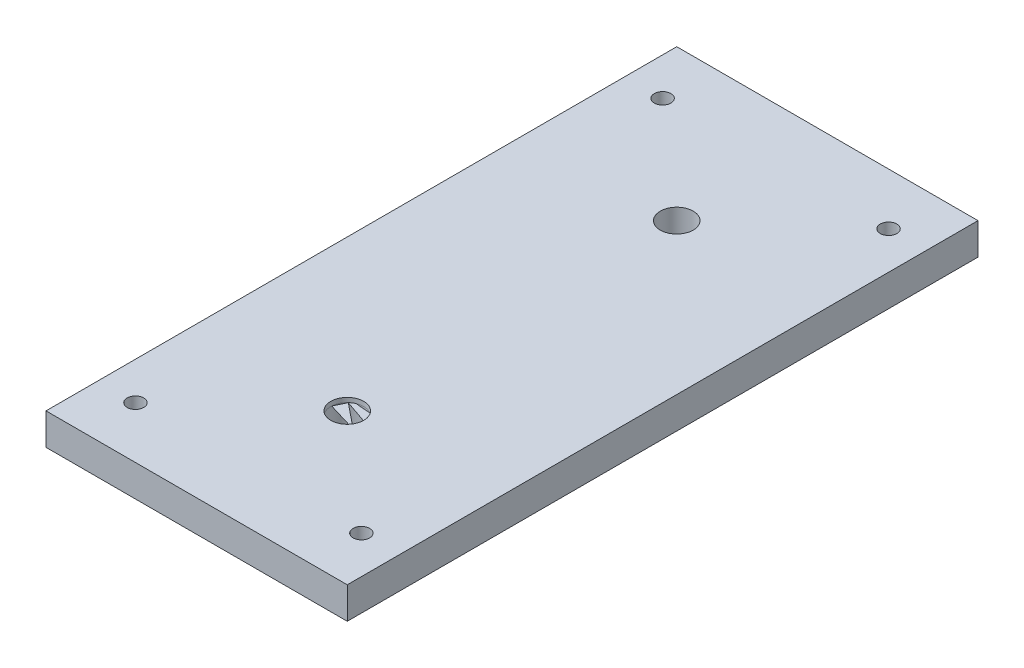
ISO-10303-21;
HEADER;
FILE_DESCRIPTION(('STEP AP214'),'2;1');
FILE_NAME('part.step','',(''),(''),'','','');
FILE_SCHEMA(('AUTOMOTIVE_DESIGN { 1 0 10303 214 1 1 1 1 }'));
ENDSEC;
DATA;
#1=APPLICATION_CONTEXT('core data for automotive mechanical design processes');
#2=APPLICATION_PROTOCOL_DEFINITION('international standard','automotive_design',2000,#1);
#3=PRODUCT_CONTEXT('',#1,'mechanical');
#4=PRODUCT('Part','Part','',(#3));
#5=PRODUCT_RELATED_PRODUCT_CATEGORY('part','',(#4));
#6=PRODUCT_DEFINITION_FORMATION('','',#4);
#7=PRODUCT_DEFINITION_CONTEXT('part definition',#1,'design');
#8=PRODUCT_DEFINITION('design','',#6,#7);
#9=PRODUCT_DEFINITION_SHAPE('','',#8);
#10=(LENGTH_UNIT() NAMED_UNIT(*) SI_UNIT(.MILLI.,.METRE.));
#11=(NAMED_UNIT(*) PLANE_ANGLE_UNIT() SI_UNIT($,.RADIAN.));
#12=(NAMED_UNIT(*) SI_UNIT($,.STERADIAN.) SOLID_ANGLE_UNIT());
#13=UNCERTAINTY_MEASURE_WITH_UNIT(LENGTH_MEASURE(1.E-05),#10,'distance_accuracy_value','');
#14=(GEOMETRIC_REPRESENTATION_CONTEXT(3) GLOBAL_UNCERTAINTY_ASSIGNED_CONTEXT((#13)) GLOBAL_UNIT_ASSIGNED_CONTEXT((#10,
#11,#12)) REPRESENTATION_CONTEXT('',''));
#15=CARTESIAN_POINT('',(0.,0.,0.));
#16=DIRECTION('',(0.,0.,1.));
#17=DIRECTION('',(1.,0.,0.));
#18=AXIS2_PLACEMENT_3D('',#15,#16,#17);
#19=CARTESIAN_POINT('',(-3.1511529728443,-11.365306556526,-3.57587472478323));
#20=DIRECTION('',(0.,-1.,0.));
#21=DIRECTION('',(0.,0.,1.));
#22=AXIS2_PLACEMENT_3D('',#19,#20,#21);
#23=SPHERICAL_SURFACE('',#22,12.7);
#24=CARTESIAN_POINT('',(-3.1511529728443,0.763193443473996,-3.57587472478323));
#25=DIRECTION('',(0.,-1.,0.));
#26=DIRECTION('',(0.,0.,-1.));
#27=AXIS2_PLACEMENT_3D('',#24,#25,#26);
#28=CIRCLE('',#27,3.76689364729083);
#29=CARTESIAN_POINT('',(-3.1511529728443,0.763193443473996,-7.34276837207405));
#30=VERTEX_POINT('',#29);
#31=EDGE_CURVE('E11',#30,#30,#28,.T.);
#32=ORIENTED_EDGE('',*,*,#31,.F.);
#33=EDGE_LOOP('',(#32));
#34=FACE_BOUND('',#33,.T.);
#35=ADVANCED_FACE('F43',(#34),#23,.T.);
#36=CARTESIAN_POINT('',(-12.2889229741077,0.763193443473996,-28.2015692205846));
#37=DIRECTION('',(0.,-1.,0.));
#38=DIRECTION('',(0.,0.,-1.));
#39=AXIS2_PLACEMENT_3D('',#36,#37,#38);
#40=PLANE('',#39);
#41=ORIENTED_EDGE('',*,*,#31,.T.);
#42=EDGE_LOOP('',(#41));
#43=FACE_BOUND('',#42,.T.);
#44=ADVANCED_FACE('F50',(#43),#40,.T.);
#45=CLOSED_SHELL('',(#35,#44));
#46=MANIFOLD_SOLID_BREP('B2',#45);
#47=CARTESIAN_POINT('',(0.,0.763193443473996,0.));
#48=DIRECTION('',(0.,1.,0.));
#49=DIRECTION('',(0.,0.,1.));
#50=AXIS2_PLACEMENT_3D('',#47,#48,#49);
#51=PLANE('',#50);
#52=CARTESIAN_POINT('',(15.8988470271548,0.763193443473996,40.8741252752168));
#53=DIRECTION('',(0.,-1.,0.));
#54=DIRECTION('',(0.,0.,-1.));
#55=AXIS2_PLACEMENT_3D('',#52,#53,#54);
#56=CIRCLE('',#55,1.397);
#57=CARTESIAN_POINT('',(15.8988470271548,0.763193443473996,39.4771252752168));
#58=VERTEX_POINT('',#57);
#59=EDGE_CURVE('E240',#58,#58,#56,.T.);
#60=ORIENTED_EDGE('',*,*,#59,.F.);
#61=EDGE_LOOP('',(#60));
#62=FACE_BOUND('',#61,.T.);
#63=CARTESIAN_POINT('',(-22.2011529728452,0.763193443473996,40.8741252752165));
#64=DIRECTION('',(0.,-1.,0.));
#65=DIRECTION('',(0.,0.,-1.));
#66=AXIS2_PLACEMENT_3D('',#63,#64,#65);
#67=CIRCLE('',#66,1.397);
#68=CARTESIAN_POINT('',(-22.2011529728452,0.763193443473996,39.4771252752165));
#69=VERTEX_POINT('',#68);
#70=EDGE_CURVE('E236',#69,#69,#67,.T.);
#71=ORIENTED_EDGE('',*,*,#70,.F.);
#72=EDGE_LOOP('',(#71));
#73=FACE_BOUND('',#72,.T.);
#74=CARTESIAN_POINT('',(15.8988470271557,0.763193443473996,-48.0258747247832));
#75=DIRECTION('',(0.,-1.,0.));
#76=DIRECTION('',(0.,0.,-1.));
#77=AXIS2_PLACEMENT_3D('',#74,#75,#76);
#78=CIRCLE('',#77,1.397);
#79=CARTESIAN_POINT('',(15.8988470271557,0.763193443473996,-49.4228747247832));
#80=VERTEX_POINT('',#79);
#81=EDGE_CURVE('E232',#80,#80,#78,.T.);
#82=ORIENTED_EDGE('',*,*,#81,.F.);
#83=EDGE_LOOP('',(#82));
#84=FACE_BOUND('',#83,.T.);
#85=CARTESIAN_POINT('',(-22.2011529728443,0.763193443473996,-48.0258747247835));
#86=DIRECTION('',(0.,-1.,0.));
#87=DIRECTION('',(0.,0.,-1.));
#88=AXIS2_PLACEMENT_3D('',#85,#86,#87);
#89=CIRCLE('',#88,1.397);
#90=CARTESIAN_POINT('',(-22.2011529728443,0.763193443473996,-49.4228747247835));
#91=VERTEX_POINT('',#90);
#92=EDGE_CURVE('E227',#91,#91,#89,.T.);
#93=ORIENTED_EDGE('',*,*,#92,.F.);
#94=EDGE_LOOP('',(#93));
#95=FACE_BOUND('',#94,.T.);
#96=DIRECTION('',(1.,0.,0.));
#97=VECTOR('',#96,1.);
#98=CARTESIAN_POINT('',(-28.5511529728443,0.763193443473996,49.6053752752168));
#99=LINE('',#98,#97);
#100=CARTESIAN_POINT('',(-28.5511529728443,0.763193443473996,49.6053752752168));
#101=VERTEX_POINT('',#100);
#102=CARTESIAN_POINT('',(22.2488470271557,0.763193443473996,49.6053752752168));
#103=VERTEX_POINT('',#102);
#104=EDGE_CURVE('E123',#101,#103,#99,.T.);
#105=ORIENTED_EDGE('',*,*,#104,.F.);
#106=DIRECTION('',(0.,0.,1.));
#107=VECTOR('',#106,1.);
#108=CARTESIAN_POINT('',(-28.5511529728443,0.763193443473996,-56.7571247247832));
#109=LINE('',#108,#107);
#110=CARTESIAN_POINT('',(-28.5511529728443,0.763193443473996,-56.7571247247832));
#111=VERTEX_POINT('',#110);
#112=EDGE_CURVE('E112',#111,#101,#109,.T.);
#113=ORIENTED_EDGE('',*,*,#112,.F.);
#114=DIRECTION('',(-1.,0.,0.));
#115=VECTOR('',#114,1.);
#116=CARTESIAN_POINT('',(-28.5511529728443,0.763193443473996,-56.7571247247832));
#117=LINE('',#116,#115);
#118=CARTESIAN_POINT('',(22.2488470271557,0.763193443473996,-56.7571247247832));
#119=VERTEX_POINT('',#118);
#120=EDGE_CURVE('E132',#119,#111,#117,.T.);
#121=ORIENTED_EDGE('',*,*,#120,.F.);
#122=DIRECTION('',(0.,0.,-1.));
#123=VECTOR('',#122,1.);
#124=CARTESIAN_POINT('',(22.2488470271557,0.763193443473996,-56.7571247247832));
#125=LINE('',#124,#123);
#126=EDGE_CURVE('E136',#103,#119,#125,.T.);
#127=ORIENTED_EDGE('',*,*,#126,.F.);
#128=EDGE_LOOP('',(#105,#113,#121,#127));
#129=FACE_BOUND('',#128,.T.);
#130=CARTESIAN_POINT('',(-3.15115297284421,0.763193443473996,-31.3571247247832));
#131=DIRECTION('',(0.,1.,0.));
#132=DIRECTION('',(0.,0.,1.));
#133=AXIS2_PLACEMENT_3D('',#130,#131,#132);
#134=CIRCLE('',#133,2.7781250000001);
#135=CARTESIAN_POINT('',(-3.15115297284431,0.763193443473996,-34.1352497247832));
#136=VERTEX_POINT('',#135);
#137=EDGE_CURVE('E224',#136,#136,#134,.T.);
#138=ORIENTED_EDGE('',*,*,#137,.T.);
#139=EDGE_LOOP('',(#138));
#140=FACE_BOUND('',#139,.T.);
#141=CARTESIAN_POINT('',(-3.17534581292681,0.763193443473996,24.2114587291356));
#142=DIRECTION('',(0.,1.,0.));
#143=DIRECTION('',(0.,0.,1.));
#144=AXIS2_PLACEMENT_3D('',#141,#142,#143);
#145=CIRCLE('',#144,2.80307098009381);
#146=CARTESIAN_POINT('',(-3.17534581292681,0.763193443473996,27.0145297092294));
#147=VERTEX_POINT('',#146);
#148=EDGE_CURVE('E144',#147,#147,#145,.T.);
#149=ORIENTED_EDGE('',*,*,#148,.T.);
#150=EDGE_LOOP('',(#149));
#151=FACE_BOUND('',#150,.T.);
#152=ADVANCED_FACE('F69',(#62,#73,#84,#95,#129,#140,#151),#51,.F.);
#153=CARTESIAN_POINT('',(-3.17534581292681,0.763193443473996,24.2114587291356));
#154=DIRECTION('',(0.,1.,0.));
#155=DIRECTION('',(0.,0.,1.));
#156=AXIS2_PLACEMENT_3D('',#153,#154,#155);
#157=CYLINDRICAL_SURFACE('',#156,2.80307098009381);
#158=ORIENTED_EDGE('',*,*,#148,.F.);
#159=EDGE_LOOP('',(#158));
#160=FACE_BOUND('',#159,.T.);
#161=CARTESIAN_POINT('',(-3.17534581292681,5.335193443474,24.2114587291356));
#162=DIRECTION('',(0.,1.,0.));
#163=DIRECTION('',(0.,0.,1.));
#164=AXIS2_PLACEMENT_3D('',#161,#162,#163);
#165=CIRCLE('',#164,2.80307098009381);
#166=CARTESIAN_POINT('',(-0.456901891047282,5.335193443474,23.5278875455415));
#167=VERTEX_POINT('',#166);
#168=EDGE_CURVE('E151',#167,#167,#165,.T.);
#169=ORIENTED_EDGE('',*,*,#168,.T.);
#170=EDGE_LOOP('',(#169));
#171=FACE_BOUND('',#170,.T.);
#172=ADVANCED_FACE('F162',(#160,#171),#157,.F.);
#173=CARTESIAN_POINT('',(-28.5511529728443,0.763193443473996,-56.7571247247832));
#174=DIRECTION('',(-1.,0.,0.));
#175=DIRECTION('',(0.,0.,1.));
#176=AXIS2_PLACEMENT_3D('',#173,#174,#175);
#177=PLANE('',#176);
#178=DIRECTION('',(0.,0.,1.));
#179=VECTOR('',#178,1.);
#180=CARTESIAN_POINT('',(-28.5511529728443,6.097193443474,-56.7571247247832));
#181=LINE('',#180,#179);
#182=CARTESIAN_POINT('',(-28.5511529728443,6.097193443474,-56.7571247247832));
#183=VERTEX_POINT('',#182);
#184=CARTESIAN_POINT('',(-28.5511529728443,6.097193443474,49.6053752752168));
#185=VERTEX_POINT('',#184);
#186=EDGE_CURVE('E142',#183,#185,#181,.T.);
#187=ORIENTED_EDGE('',*,*,#186,.F.);
#188=DIRECTION('',(0.,1.,0.));
#189=VECTOR('',#188,1.);
#190=CARTESIAN_POINT('',(-28.5511529728443,0.763193443473996,-56.7571247247832));
#191=LINE('',#190,#189);
#192=EDGE_CURVE('E118',#111,#183,#191,.T.);
#193=ORIENTED_EDGE('',*,*,#192,.F.);
#194=ORIENTED_EDGE('',*,*,#112,.T.);
#195=DIRECTION('',(0.,1.,0.));
#196=VECTOR('',#195,1.);
#197=CARTESIAN_POINT('',(-28.5511529728443,0.763193443473996,49.6053752752168));
#198=LINE('',#197,#196);
#199=EDGE_CURVE('E115',#101,#185,#198,.T.);
#200=ORIENTED_EDGE('',*,*,#199,.T.);
#201=EDGE_LOOP('',(#187,#193,#194,#200));
#202=FACE_BOUND('',#201,.T.);
#203=ADVANCED_FACE('F114',(#202),#177,.T.);
#204=CARTESIAN_POINT('',(-28.5511529728443,0.763193443473996,-56.7571247247832));
#205=DIRECTION('',(0.,0.,-1.));
#206=DIRECTION('',(-1.,0.,0.));
#207=AXIS2_PLACEMENT_3D('',#204,#205,#206);
#208=PLANE('',#207);
#209=DIRECTION('',(-1.,0.,0.));
#210=VECTOR('',#209,1.);
#211=CARTESIAN_POINT('',(-28.5511529728443,6.097193443474,-56.7571247247832));
#212=LINE('',#211,#210);
#213=CARTESIAN_POINT('',(22.2488470271557,6.097193443474,-56.7571247247832));
#214=VERTEX_POINT('',#213);
#215=EDGE_CURVE('E124',#214,#183,#212,.T.);
#216=ORIENTED_EDGE('',*,*,#215,.F.);
#217=DIRECTION('',(0.,1.,0.));
#218=VECTOR('',#217,1.);
#219=CARTESIAN_POINT('',(22.2488470271557,0.763193443473996,-56.7571247247832));
#220=LINE('',#219,#218);
#221=EDGE_CURVE('E152',#119,#214,#220,.T.);
#222=ORIENTED_EDGE('',*,*,#221,.F.);
#223=ORIENTED_EDGE('',*,*,#120,.T.);
#224=ORIENTED_EDGE('',*,*,#192,.T.);
#225=EDGE_LOOP('',(#216,#222,#223,#224));
#226=FACE_BOUND('',#225,.T.);
#227=ADVANCED_FACE('F170',(#226),#208,.T.);
#228=CARTESIAN_POINT('',(22.2488470271557,0.763193443473996,-56.7571247247832));
#229=DIRECTION('',(1.,0.,0.));
#230=DIRECTION('',(0.,0.,-1.));
#231=AXIS2_PLACEMENT_3D('',#228,#229,#230);
#232=PLANE('',#231);
#233=DIRECTION('',(0.,0.,-1.));
#234=VECTOR('',#233,1.);
#235=CARTESIAN_POINT('',(22.2488470271557,6.097193443474,-56.7571247247832));
#236=LINE('',#235,#234);
#237=CARTESIAN_POINT('',(22.2488470271557,6.097193443474,49.6053752752168));
#238=VERTEX_POINT('',#237);
#239=EDGE_CURVE('E146',#238,#214,#236,.T.);
#240=ORIENTED_EDGE('',*,*,#239,.F.);
#241=DIRECTION('',(0.,1.,0.));
#242=VECTOR('',#241,1.);
#243=CARTESIAN_POINT('',(22.2488470271557,0.763193443473996,49.6053752752168));
#244=LINE('',#243,#242);
#245=EDGE_CURVE('E131',#103,#238,#244,.T.);
#246=ORIENTED_EDGE('',*,*,#245,.F.);
#247=ORIENTED_EDGE('',*,*,#126,.T.);
#248=ORIENTED_EDGE('',*,*,#221,.T.);
#249=EDGE_LOOP('',(#240,#246,#247,#248));
#250=FACE_BOUND('',#249,.T.);
#251=ADVANCED_FACE('F181',(#250),#232,.T.);
#252=CARTESIAN_POINT('',(-28.5511529728443,0.763193443473996,49.6053752752168));
#253=DIRECTION('',(0.,0.,1.));
#254=DIRECTION('',(1.,0.,0.));
#255=AXIS2_PLACEMENT_3D('',#252,#253,#254);
#256=PLANE('',#255);
#257=DIRECTION('',(1.,0.,0.));
#258=VECTOR('',#257,1.);
#259=CARTESIAN_POINT('',(-28.5511529728443,6.097193443474,49.6053752752168));
#260=LINE('',#259,#258);
#261=EDGE_CURVE('E130',#185,#238,#260,.T.);
#262=ORIENTED_EDGE('',*,*,#261,.F.);
#263=ORIENTED_EDGE('',*,*,#199,.F.);
#264=ORIENTED_EDGE('',*,*,#104,.T.);
#265=ORIENTED_EDGE('',*,*,#245,.T.);
#266=EDGE_LOOP('',(#262,#263,#264,#265));
#267=FACE_BOUND('',#266,.T.);
#268=ADVANCED_FACE('F128',(#267),#256,.T.);
#269=CARTESIAN_POINT('',(-3.1511529728443,6.097193443474,-3.57587472478323));
#270=DIRECTION('',(0.,1.,0.));
#271=DIRECTION('',(0.,0.,1.));
#272=AXIS2_PLACEMENT_3D('',#269,#270,#271);
#273=PLANE('',#272);
#274=CARTESIAN_POINT('',(15.8988470271548,6.097193443474,40.8741252752168));
#275=DIRECTION('',(0.,-1.,0.));
#276=DIRECTION('',(0.,0.,-1.));
#277=AXIS2_PLACEMENT_3D('',#274,#275,#276);
#278=CIRCLE('',#277,1.397);
#279=CARTESIAN_POINT('',(15.8988470271548,6.097193443474,39.4771252752168));
#280=VERTEX_POINT('',#279);
#281=EDGE_CURVE('E203',#280,#280,#278,.T.);
#282=ORIENTED_EDGE('',*,*,#281,.T.);
#283=EDGE_LOOP('',(#282));
#284=FACE_BOUND('',#283,.T.);
#285=CARTESIAN_POINT('',(-22.2011529728452,6.097193443474,40.8741252752165));
#286=DIRECTION('',(0.,-1.,0.));
#287=DIRECTION('',(0.,0.,-1.));
#288=AXIS2_PLACEMENT_3D('',#285,#286,#287);
#289=CIRCLE('',#288,1.397);
#290=CARTESIAN_POINT('',(-22.2011529728452,6.097193443474,39.4771252752165));
#291=VERTEX_POINT('',#290);
#292=EDGE_CURVE('E207',#291,#291,#289,.T.);
#293=ORIENTED_EDGE('',*,*,#292,.T.);
#294=EDGE_LOOP('',(#293));
#295=FACE_BOUND('',#294,.T.);
#296=CARTESIAN_POINT('',(15.8988470271557,6.097193443474,-48.0258747247832));
#297=DIRECTION('',(0.,-1.,0.));
#298=DIRECTION('',(0.,0.,-1.));
#299=AXIS2_PLACEMENT_3D('',#296,#297,#298);
#300=CIRCLE('',#299,1.397);
#301=CARTESIAN_POINT('',(15.8988470271557,6.097193443474,-49.4228747247832));
#302=VERTEX_POINT('',#301);
#303=EDGE_CURVE('E211',#302,#302,#300,.T.);
#304=ORIENTED_EDGE('',*,*,#303,.T.);
#305=EDGE_LOOP('',(#304));
#306=FACE_BOUND('',#305,.T.);
#307=CARTESIAN_POINT('',(-22.2011529728443,6.097193443474,-48.0258747247835));
#308=DIRECTION('',(0.,-1.,0.));
#309=DIRECTION('',(0.,0.,-1.));
#310=AXIS2_PLACEMENT_3D('',#307,#308,#309);
#311=CIRCLE('',#310,1.397);
#312=CARTESIAN_POINT('',(-22.2011529728443,6.097193443474,-49.4228747247835));
#313=VERTEX_POINT('',#312);
#314=EDGE_CURVE('E215',#313,#313,#311,.T.);
#315=ORIENTED_EDGE('',*,*,#314,.T.);
#316=EDGE_LOOP('',(#315));
#317=FACE_BOUND('',#316,.T.);
#318=ORIENTED_EDGE('',*,*,#239,.T.);
#319=ORIENTED_EDGE('',*,*,#215,.T.);
#320=ORIENTED_EDGE('',*,*,#186,.T.);
#321=ORIENTED_EDGE('',*,*,#261,.T.);
#322=EDGE_LOOP('',(#318,#319,#320,#321));
#323=FACE_BOUND('',#322,.T.);
#324=CARTESIAN_POINT('',(-3.1511529728443,6.097193443474,24.2053752752168));
#325=DIRECTION('',(0.,1.,0.));
#326=DIRECTION('',(0.,0.,1.));
#327=AXIS2_PLACEMENT_3D('',#324,#325,#326);
#328=CIRCLE('',#327,2.778125);
#329=CARTESIAN_POINT('',(-3.1511529728443,6.097193443474,26.9835002752168));
#330=VERTEX_POINT('',#329);
#331=EDGE_CURVE('E77',#330,#330,#328,.T.);
#332=ORIENTED_EDGE('',*,*,#331,.F.);
#333=EDGE_LOOP('',(#332));
#334=FACE_BOUND('',#333,.T.);
#335=CARTESIAN_POINT('',(-3.15115297284431,6.097193443474,-31.3571247247832));
#336=DIRECTION('',(0.,1.,0.));
#337=DIRECTION('',(0.,0.,1.));
#338=AXIS2_PLACEMENT_3D('',#335,#336,#337);
#339=CIRCLE('',#338,2.778125);
#340=CARTESIAN_POINT('',(-3.15115297284431,6.097193443474,-34.1352497247832));
#341=VERTEX_POINT('',#340);
#342=EDGE_CURVE('E41',#341,#341,#339,.T.);
#343=ORIENTED_EDGE('',*,*,#342,.F.);
#344=EDGE_LOOP('',(#343));
#345=FACE_BOUND('',#344,.T.);
#346=CARTESIAN_POINT('',(-3.1511529728443,6.09719344347399,-3.57587472478323));
#347=VERTEX_POINT('',#346);
#348=VERTEX_LOOP('',#347);
#349=FACE_BOUND('',#348,.T.);
#350=ADVANCED_FACE('F187',(#284,#295,#306,#317,#323,#334,#345,#349),#273,.T.);
#351=CARTESIAN_POINT('',(-3.15115297284431,6.097193443474,-31.3571247247832));
#352=DIRECTION('',(0.,-1.,0.));
#353=DIRECTION('',(0.,0.,-1.));
#354=AXIS2_PLACEMENT_3D('',#351,#352,#353);
#355=CYLINDRICAL_SURFACE('',#354,2.778125);
#356=CARTESIAN_POINT('',(-3.15115297284431,6.097193443474,-34.1352497247832));
#357=CARTESIAN_POINT('',(-3.15115297284431,6.041630943474,-34.1352497247832));
#358=CARTESIAN_POINT('',(-3.15115297284431,5.98606844347399,-34.1352497247832));
#359=CARTESIAN_POINT('',(-3.15115297284431,5.874943443474,-34.1352497247832));
#360=CARTESIAN_POINT('',(-3.15115297284431,5.81938094347399,-34.1352497247832));
#361=CARTESIAN_POINT('',(-3.15115297284431,5.708255943474,-34.1352497247832));
#362=CARTESIAN_POINT('',(-3.15115297284431,5.65269344347399,-34.1352497247832));
#363=CARTESIAN_POINT('',(-3.15115297284431,5.541568443474,-34.1352497247832));
#364=CARTESIAN_POINT('',(-3.15115297284431,5.48600594347399,-34.1352497247832));
#365=CARTESIAN_POINT('',(-3.15115297284431,5.37488094347399,-34.1352497247832));
#366=CARTESIAN_POINT('',(-3.15115297284431,5.319318443474,-34.1352497247832));
#367=CARTESIAN_POINT('',(-3.15115297284431,5.20819344347399,-34.1352497247832));
#368=CARTESIAN_POINT('',(-3.15115297284431,5.152630943474,-34.1352497247832));
#369=CARTESIAN_POINT('',(-3.15115297284431,5.04150594347399,-34.1352497247832));
#370=CARTESIAN_POINT('',(-3.15115297284431,4.985943443474,-34.1352497247832));
#371=CARTESIAN_POINT('',(-3.15115297284431,4.87481844347399,-34.1352497247832));
#372=CARTESIAN_POINT('',(-3.15115297284431,4.81925594347399,-34.1352497247832));
#373=CARTESIAN_POINT('',(-3.15115297284431,4.70813094347399,-34.1352497247832));
#374=CARTESIAN_POINT('',(-3.15115297284431,4.65256844347399,-34.1352497247832));
#375=CARTESIAN_POINT('',(-3.15115297284431,4.54144344347399,-34.1352497247832));
#376=CARTESIAN_POINT('',(-3.15115297284431,4.485880943474,-34.1352497247832));
#377=CARTESIAN_POINT('',(-3.15115297284431,4.374755943474,-34.1352497247832));
#378=CARTESIAN_POINT('',(-3.15115297284431,4.319193443474,-34.1352497247832));
#379=CARTESIAN_POINT('',(-3.15115297284431,4.208068443474,-34.1352497247832));
#380=CARTESIAN_POINT('',(-3.15115297284431,4.15250594347399,-34.1352497247832));
#381=CARTESIAN_POINT('',(-3.15115297284431,4.041380943474,-34.1352497247832));
#382=CARTESIAN_POINT('',(-3.15115297284431,3.985818443474,-34.1352497247832));
#383=CARTESIAN_POINT('',(-3.15115297284431,3.874693443474,-34.1352497247832));
#384=CARTESIAN_POINT('',(-3.15115297284431,3.819130943474,-34.1352497247832));
#385=CARTESIAN_POINT('',(-3.15115297284431,3.70800594347399,-34.1352497247832));
#386=CARTESIAN_POINT('',(-3.15115297284431,3.652443443474,-34.1352497247832));
#387=CARTESIAN_POINT('',(-3.15115297284431,3.541318443474,-34.1352497247832));
#388=CARTESIAN_POINT('',(-3.15115297284431,3.485755943474,-34.1352497247832));
#389=CARTESIAN_POINT('',(-3.15115297284431,3.374630943474,-34.1352497247832));
#390=CARTESIAN_POINT('',(-3.15115297284431,3.31906844347399,-34.1352497247832));
#391=CARTESIAN_POINT('',(-3.15115297284431,3.207943443474,-34.1352497247832));
#392=CARTESIAN_POINT('',(-3.15115297284431,3.152380943474,-34.1352497247832));
#393=CARTESIAN_POINT('',(-3.15115297284431,3.041255943474,-34.1352497247832));
#394=CARTESIAN_POINT('',(-3.15115297284431,2.985693443474,-34.1352497247832));
#395=CARTESIAN_POINT('',(-3.15115297284431,2.87456844347399,-34.1352497247832));
#396=CARTESIAN_POINT('',(-3.15115297284431,2.819005943474,-34.1352497247832));
#397=CARTESIAN_POINT('',(-3.15115297284431,2.707880943474,-34.1352497247832));
#398=CARTESIAN_POINT('',(-3.15115297284431,2.652318443474,-34.1352497247832));
#399=CARTESIAN_POINT('',(-3.15115297284431,2.541193443474,-34.1352497247832));
#400=CARTESIAN_POINT('',(-3.15115297284431,2.48563094347399,-34.1352497247832));
#401=CARTESIAN_POINT('',(-3.15115297284431,2.374505943474,-34.1352497247832));
#402=CARTESIAN_POINT('',(-3.15115297284431,2.318943443474,-34.1352497247832));
#403=CARTESIAN_POINT('',(-3.15115297284431,2.207818443474,-34.1352497247832));
#404=CARTESIAN_POINT('',(-3.15115297284431,2.152255943474,-34.1352497247832));
#405=CARTESIAN_POINT('',(-3.15115297284431,2.041130943474,-34.1352497247832));
#406=CARTESIAN_POINT('',(-3.15115297284431,1.985568443474,-34.1352497247832));
#407=CARTESIAN_POINT('',(-3.15115297284431,1.874443443474,-34.1352497247832));
#408=CARTESIAN_POINT('',(-3.15115297284431,1.818880943474,-34.1352497247832));
#409=CARTESIAN_POINT('',(-3.15115297284431,1.707755943474,-34.1352497247832));
#410=CARTESIAN_POINT('',(-3.15115297284431,1.652193443474,-34.1352497247832));
#411=CARTESIAN_POINT('',(-3.15115297284431,1.541068443474,-34.1352497247832));
#412=CARTESIAN_POINT('',(-3.15115297284431,1.485505943474,-34.1352497247832));
#413=CARTESIAN_POINT('',(-3.15115297284431,1.374380943474,-34.1352497247832));
#414=CARTESIAN_POINT('',(-3.15115297284431,1.318818443474,-34.1352497247832));
#415=CARTESIAN_POINT('',(-3.15115297284431,1.207693443474,-34.1352497247832));
#416=CARTESIAN_POINT('',(-3.15115297284431,1.152130943474,-34.1352497247832));
#417=CARTESIAN_POINT('',(-3.15115297284431,1.041005943474,-34.1352497247832));
#418=CARTESIAN_POINT('',(-3.15115297284431,0.985443443473996,-34.1352497247832));
#419=CARTESIAN_POINT('',(-3.15115297284431,0.874318443473996,-34.1352497247832));
#420=CARTESIAN_POINT('',(-3.15115297284431,0.818755943473996,-34.1352497247832));
#421=CARTESIAN_POINT('',(-3.15115297284431,0.763193443473996,-34.1352497247832));
#422=B_SPLINE_CURVE_WITH_KNOTS('',3,(#356,#357,#358,#359,#360,#361,#362,#363,#364,#365,#366,
#367,#368,#369,#370,#371,#372,#373,#374,#375,#376,#377,#378,#379,#380,#381,#382,#383,#384,#385,
#386,#387,#388,#389,#390,#391,#392,#393,#394,#395,#396,#397,#398,#399,#400,#401,#402,#403,#404,
#405,#406,#407,#408,#409,#410,#411,#412,#413,#414,#415,#416,#417,#418,#419,#420,#421),
.UNSPECIFIED.,.F.,.F.,(4,2,2,2,2,2,2,2,2,2,2,2,2,2,2,2,2,2,2,2,2,2,2,2,2,2,2,2,2,2,2,2,4),(0.,
0.1666875,0.333375,0.500062500000001,0.666750000000001,0.8334375,1.000125,1.1668125,1.3335,
1.5001875,1.666875,1.8335625,2.00025,2.1669375,2.333625,2.5003125,2.667,2.8336875,3.000375,
3.1670625,3.33375,3.5004375,3.667125,3.8338125,4.0005,4.1671875,4.333875,4.5005625,4.66725,
4.8339375,5.000625,5.1673125,5.334),.UNSPECIFIED.);
#423=EDGE_CURVE('BSEAM192',#341,#136,#422,.T.);
#424=ORIENTED_EDGE('',*,*,#342,.T.);
#425=ORIENTED_EDGE('',*,*,#137,.F.);
#426=ORIENTED_EDGE('',*,*,#423,.T.);
#427=ORIENTED_EDGE('',*,*,#423,.F.);
#428=EDGE_LOOP('',(#424,#426,#425,#427));
#429=FACE_BOUND('',#428,.T.);
#430=ADVANCED_FACE('F192',(#429),#355,.F.);
#431=CARTESIAN_POINT('',(-3.1511529728443,6.097193443474,24.2053752752168));
#432=DIRECTION('',(0.,-1.,0.));
#433=DIRECTION('',(0.,0.,-1.));
#434=AXIS2_PLACEMENT_3D('',#431,#432,#433);
#435=CYLINDRICAL_SURFACE('',#434,2.778125);
#436=ORIENTED_EDGE('',*,*,#331,.T.);
#437=EDGE_LOOP('',(#436));
#438=FACE_BOUND('',#437,.T.);
#439=CARTESIAN_POINT('',(-3.1511529728443,5.335193443474,24.2053752752168));
#440=DIRECTION('',(0.,1.,0.));
#441=DIRECTION('',(0.,0.,1.));
#442=AXIS2_PLACEMENT_3D('',#439,#440,#441);
#443=CIRCLE('',#442,2.778125);
#444=EDGE_CURVE('E85',#167,#167,#443,.T.);
#445=ORIENTED_EDGE('',*,*,#444,.F.);
#446=EDGE_LOOP('',(#445));
#447=FACE_BOUND('',#446,.T.);
#448=ADVANCED_FACE('F189',(#438,#447),#435,.F.);
#449=CARTESIAN_POINT('',(-3.1511529728443,5.335193443474,-3.57587472478323));
#450=DIRECTION('',(0.,1.,0.));
#451=DIRECTION('',(0.,0.,1.));
#452=AXIS2_PLACEMENT_3D('',#449,#450,#451);
#453=PLANE('',#452);
#454=ORIENTED_EDGE('',*,*,#444,.T.);
#455=ORIENTED_EDGE('',*,*,#168,.F.);
#456=EDGE_LOOP('',(#454,#455));
#457=FACE_BOUND('',#456,.T.);
#458=ADVANCED_FACE('F71',(#457),#453,.F.);
#459=CARTESIAN_POINT('',(-22.2011529728443,6.097193443474,-48.0258747247835));
#460=DIRECTION('',(0.,-1.,0.));
#461=DIRECTION('',(0.,0.,-1.));
#462=AXIS2_PLACEMENT_3D('',#459,#460,#461);
#463=CYLINDRICAL_SURFACE('',#462,1.397);
#464=ORIENTED_EDGE('',*,*,#314,.F.);
#465=EDGE_LOOP('',(#464));
#466=FACE_BOUND('',#465,.T.);
#467=ORIENTED_EDGE('',*,*,#92,.T.);
#468=EDGE_LOOP('',(#467));
#469=FACE_BOUND('',#468,.T.);
#470=ADVANCED_FACE('F176',(#466,#469),#463,.F.);
#471=CARTESIAN_POINT('',(15.8988470271557,6.097193443474,-48.0258747247832));
#472=DIRECTION('',(0.,-1.,0.));
#473=DIRECTION('',(0.,0.,-1.));
#474=AXIS2_PLACEMENT_3D('',#471,#472,#473);
#475=CYLINDRICAL_SURFACE('',#474,1.397);
#476=ORIENTED_EDGE('',*,*,#303,.F.);
#477=EDGE_LOOP('',(#476));
#478=FACE_BOUND('',#477,.T.);
#479=ORIENTED_EDGE('',*,*,#81,.T.);
#480=EDGE_LOOP('',(#479));
#481=FACE_BOUND('',#480,.T.);
#482=ADVANCED_FACE('F254',(#478,#481),#475,.F.);
#483=CARTESIAN_POINT('',(-22.2011529728452,6.097193443474,40.8741252752165));
#484=DIRECTION('',(0.,-1.,0.));
#485=DIRECTION('',(0.,0.,-1.));
#486=AXIS2_PLACEMENT_3D('',#483,#484,#485);
#487=CYLINDRICAL_SURFACE('',#486,1.397);
#488=ORIENTED_EDGE('',*,*,#292,.F.);
#489=EDGE_LOOP('',(#488));
#490=FACE_BOUND('',#489,.T.);
#491=ORIENTED_EDGE('',*,*,#70,.T.);
#492=EDGE_LOOP('',(#491));
#493=FACE_BOUND('',#492,.T.);
#494=ADVANCED_FACE('F260',(#490,#493),#487,.F.);
#495=CARTESIAN_POINT('',(15.8988470271548,6.097193443474,40.8741252752168));
#496=DIRECTION('',(0.,-1.,0.));
#497=DIRECTION('',(0.,0.,-1.));
#498=AXIS2_PLACEMENT_3D('',#495,#496,#497);
#499=CYLINDRICAL_SURFACE('',#498,1.397);
#500=ORIENTED_EDGE('',*,*,#281,.F.);
#501=EDGE_LOOP('',(#500));
#502=FACE_BOUND('',#501,.T.);
#503=ORIENTED_EDGE('',*,*,#59,.T.);
#504=EDGE_LOOP('',(#503));
#505=FACE_BOUND('',#504,.T.);
#506=ADVANCED_FACE('F245',(#502,#505),#499,.F.);
#507=CLOSED_SHELL('',(#152,#172,#203,#227,#251,#268,#350,#430,#448,#458,#470,#482,#494,#506));
#508=MANIFOLD_SOLID_BREP('B6',#507);
#509=ADVANCED_BREP_SHAPE_REPRESENTATION('',(#18,#46,#508),#14);
#510=SHAPE_DEFINITION_REPRESENTATION(#9,#509);
ENDSEC;
END-ISO-10303-21;
